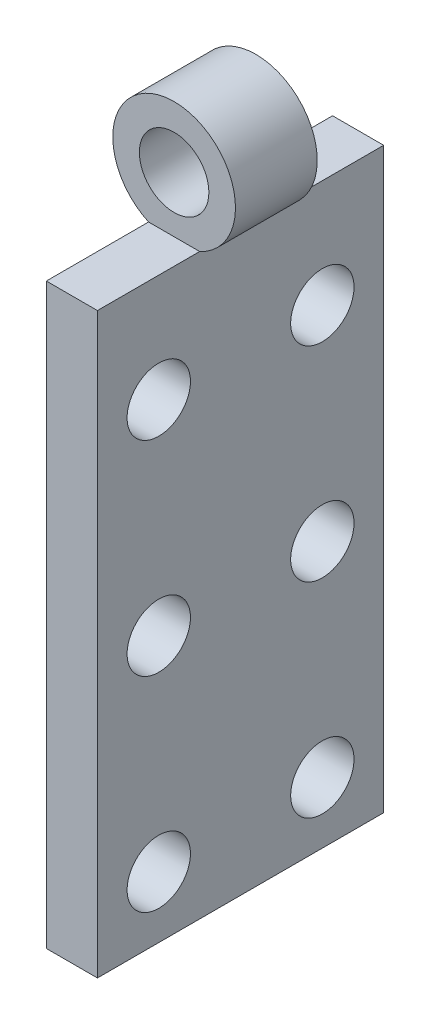
ISO-10303-21;
HEADER;
FILE_DESCRIPTION(('STEP AP214'),'2;1');
FILE_NAME('part.step','',(''),(''),'','','');
FILE_SCHEMA(('AUTOMOTIVE_DESIGN { 1 0 10303 214 1 1 1 1 }'));
ENDSEC;
DATA;
#1=APPLICATION_CONTEXT('core data for automotive mechanical design processes');
#2=APPLICATION_PROTOCOL_DEFINITION('international standard','automotive_design',2000,#1);
#3=PRODUCT_CONTEXT('',#1,'mechanical');
#4=PRODUCT('Part','Part','',(#3));
#5=PRODUCT_RELATED_PRODUCT_CATEGORY('part','',(#4));
#6=PRODUCT_DEFINITION_FORMATION('','',#4);
#7=PRODUCT_DEFINITION_CONTEXT('part definition',#1,'design');
#8=PRODUCT_DEFINITION('design','',#6,#7);
#9=PRODUCT_DEFINITION_SHAPE('','',#8);
#10=(LENGTH_UNIT() NAMED_UNIT(*) SI_UNIT(.MILLI.,.METRE.));
#11=(NAMED_UNIT(*) PLANE_ANGLE_UNIT() SI_UNIT($,.RADIAN.));
#12=(NAMED_UNIT(*) SI_UNIT($,.STERADIAN.) SOLID_ANGLE_UNIT());
#13=UNCERTAINTY_MEASURE_WITH_UNIT(LENGTH_MEASURE(1.E-05),#10,'distance_accuracy_value','');
#14=(GEOMETRIC_REPRESENTATION_CONTEXT(3) GLOBAL_UNCERTAINTY_ASSIGNED_CONTEXT((#13)) GLOBAL_UNIT_ASSIGNED_CONTEXT((#10,
#11,#12)) REPRESENTATION_CONTEXT('',''));
#15=CARTESIAN_POINT('',(0.,0.,0.));
#16=DIRECTION('',(0.,0.,1.));
#17=DIRECTION('',(1.,0.,0.));
#18=AXIS2_PLACEMENT_3D('',#15,#16,#17);
#19=CARTESIAN_POINT('',(-1.25,15.2728219713411,7.));
#20=DIRECTION('',(0.,1.,0.));
#21=DIRECTION('',(0.,0.,1.));
#22=AXIS2_PLACEMENT_3D('',#19,#20,#21);
#23=PLANE('',#22);
#24=DIRECTION('',(0.,0.,-1.));
#25=VECTOR('',#24,1.);
#26=CARTESIAN_POINT('',(-1.25,15.2728219713411,7.));
#27=LINE('',#26,#25);
#28=CARTESIAN_POINT('',(-1.25,15.2728219713411,-2.));
#29=VERTEX_POINT('',#28);
#30=CARTESIAN_POINT('',(-1.25,15.2728219713411,-7.));
#31=VERTEX_POINT('',#30);
#32=EDGE_CURVE('E117',#29,#31,#27,.T.);
#33=ORIENTED_EDGE('',*,*,#32,.F.);
#34=DIRECTION('',(1.,0.,0.));
#35=VECTOR('',#34,1.);
#36=CARTESIAN_POINT('',(-1.25,15.2728219713411,-2.));
#37=LINE('',#36,#35);
#38=CARTESIAN_POINT('',(1.25,15.2728219713411,-2.));
#39=VERTEX_POINT('',#38);
#40=EDGE_CURVE('E109',#29,#39,#37,.T.);
#41=ORIENTED_EDGE('',*,*,#40,.T.);
#42=DIRECTION('',(0.,0.,-1.));
#43=VECTOR('',#42,1.);
#44=CARTESIAN_POINT('',(1.25,15.2728219713411,7.));
#45=LINE('',#44,#43);
#46=CARTESIAN_POINT('',(1.25,15.2728219713411,-7.));
#47=VERTEX_POINT('',#46);
#48=EDGE_CURVE('E115',#39,#47,#45,.T.);
#49=ORIENTED_EDGE('',*,*,#48,.T.);
#50=DIRECTION('',(1.,0.,0.));
#51=VECTOR('',#50,1.);
#52=CARTESIAN_POINT('',(-1.25,15.2728219713411,-7.));
#53=LINE('',#52,#51);
#54=EDGE_CURVE('E172',#31,#47,#53,.T.);
#55=ORIENTED_EDGE('',*,*,#54,.F.);
#56=EDGE_LOOP('',(#33,#41,#49,#55));
#57=FACE_BOUND('',#56,.T.);
#58=ADVANCED_FACE('F35',(#57),#23,.T.);
#59=CARTESIAN_POINT('',(-1.25,-13.,7.));
#60=DIRECTION('',(0.,1.,0.));
#61=DIRECTION('',(0.,0.,1.));
#62=AXIS2_PLACEMENT_3D('',#59,#60,#61);
#63=PLANE('',#62);
#64=DIRECTION('',(1.,0.,0.));
#65=VECTOR('',#64,1.);
#66=CARTESIAN_POINT('',(-1.25,-13.,-7.));
#67=LINE('',#66,#65);
#68=CARTESIAN_POINT('',(-1.25,-13.,-7.));
#69=VERTEX_POINT('',#68);
#70=CARTESIAN_POINT('',(1.25,-13.,-7.));
#71=VERTEX_POINT('',#70);
#72=EDGE_CURVE('E103',#69,#71,#67,.T.);
#73=ORIENTED_EDGE('',*,*,#72,.T.);
#74=DIRECTION('',(0.,0.,-1.));
#75=VECTOR('',#74,1.);
#76=CARTESIAN_POINT('',(1.25,-13.,7.));
#77=LINE('',#76,#75);
#78=CARTESIAN_POINT('',(1.25,-13.,7.));
#79=VERTEX_POINT('',#78);
#80=EDGE_CURVE('E11',#79,#71,#77,.T.);
#81=ORIENTED_EDGE('',*,*,#80,.F.);
#82=DIRECTION('',(1.,0.,0.));
#83=VECTOR('',#82,1.);
#84=CARTESIAN_POINT('',(-1.25,-13.,7.));
#85=LINE('',#84,#83);
#86=CARTESIAN_POINT('',(-1.25,-13.,7.));
#87=VERTEX_POINT('',#86);
#88=EDGE_CURVE('E161',#87,#79,#85,.T.);
#89=ORIENTED_EDGE('',*,*,#88,.F.);
#90=DIRECTION('',(0.,0.,-1.));
#91=VECTOR('',#90,1.);
#92=CARTESIAN_POINT('',(-1.25,-13.,7.));
#93=LINE('',#92,#91);
#94=EDGE_CURVE('E61',#87,#69,#93,.T.);
#95=ORIENTED_EDGE('',*,*,#94,.T.);
#96=EDGE_LOOP('',(#73,#81,#89,#95));
#97=FACE_BOUND('',#96,.T.);
#98=ADVANCED_FACE('F37',(#97),#63,.F.);
#99=CARTESIAN_POINT('',(1.25,-13.,7.));
#100=DIRECTION('',(-1.,0.,0.));
#101=DIRECTION('',(0.,0.,1.));
#102=AXIS2_PLACEMENT_3D('',#99,#100,#101);
#103=PLANE('',#102);
#104=CARTESIAN_POINT('',(1.25,0.,4.));
#105=DIRECTION('',(1.,0.,0.));
#106=DIRECTION('',(0.,0.,-1.));
#107=AXIS2_PLACEMENT_3D('',#104,#105,#106);
#108=CIRCLE('',#107,1.55);
#109=CARTESIAN_POINT('',(1.25,0.,2.45));
#110=VERTEX_POINT('',#109);
#111=EDGE_CURVE('E214',#110,#110,#108,.T.);
#112=ORIENTED_EDGE('',*,*,#111,.F.);
#113=EDGE_LOOP('',(#112));
#114=FACE_BOUND('',#113,.T.);
#115=CARTESIAN_POINT('',(1.25,10.,4.));
#116=DIRECTION('',(1.,0.,0.));
#117=DIRECTION('',(0.,0.,-1.));
#118=AXIS2_PLACEMENT_3D('',#115,#116,#117);
#119=CIRCLE('',#118,1.55);
#120=CARTESIAN_POINT('',(1.25,10.,2.45));
#121=VERTEX_POINT('',#120);
#122=EDGE_CURVE('E218',#121,#121,#119,.T.);
#123=ORIENTED_EDGE('',*,*,#122,.F.);
#124=EDGE_LOOP('',(#123));
#125=FACE_BOUND('',#124,.T.);
#126=CARTESIAN_POINT('',(1.25,10.,-4.));
#127=DIRECTION('',(1.,0.,0.));
#128=DIRECTION('',(0.,0.,-1.));
#129=AXIS2_PLACEMENT_3D('',#126,#127,#128);
#130=CIRCLE('',#129,1.55);
#131=CARTESIAN_POINT('',(1.25,10.,-5.55));
#132=VERTEX_POINT('',#131);
#133=EDGE_CURVE('E222',#132,#132,#130,.T.);
#134=ORIENTED_EDGE('',*,*,#133,.F.);
#135=EDGE_LOOP('',(#134));
#136=FACE_BOUND('',#135,.T.);
#137=CARTESIAN_POINT('',(1.25,-10.,-4.));
#138=DIRECTION('',(1.,0.,0.));
#139=DIRECTION('',(0.,0.,1.));
#140=AXIS2_PLACEMENT_3D('',#137,#138,#139);
#141=CIRCLE('',#140,1.55);
#142=CARTESIAN_POINT('',(1.25,-10.,-2.45));
#143=VERTEX_POINT('',#142);
#144=EDGE_CURVE('E226',#143,#143,#141,.T.);
#145=ORIENTED_EDGE('',*,*,#144,.F.);
#146=EDGE_LOOP('',(#145));
#147=FACE_BOUND('',#146,.T.);
#148=CARTESIAN_POINT('',(1.25,-10.,4.));
#149=DIRECTION('',(1.,0.,0.));
#150=DIRECTION('',(0.,0.,1.));
#151=AXIS2_PLACEMENT_3D('',#148,#149,#150);
#152=CIRCLE('',#151,1.55);
#153=CARTESIAN_POINT('',(1.25,-10.,5.55));
#154=VERTEX_POINT('',#153);
#155=EDGE_CURVE('E230',#154,#154,#152,.T.);
#156=ORIENTED_EDGE('',*,*,#155,.F.);
#157=EDGE_LOOP('',(#156));
#158=FACE_BOUND('',#157,.T.);
#159=CARTESIAN_POINT('',(1.25,0.,-4.));
#160=DIRECTION('',(1.,0.,0.));
#161=DIRECTION('',(0.,0.,-1.));
#162=AXIS2_PLACEMENT_3D('',#159,#160,#161);
#163=CIRCLE('',#162,1.55);
#164=CARTESIAN_POINT('',(1.25,0.,-5.55));
#165=VERTEX_POINT('',#164);
#166=EDGE_CURVE('E137',#165,#165,#163,.T.);
#167=ORIENTED_EDGE('',*,*,#166,.F.);
#168=EDGE_LOOP('',(#167));
#169=FACE_BOUND('',#168,.T.);
#170=DIRECTION('',(0.,1.,0.));
#171=VECTOR('',#170,1.);
#172=CARTESIAN_POINT('',(1.25,-13.,-7.));
#173=LINE('',#172,#171);
#174=EDGE_CURVE('E121',#71,#47,#173,.T.);
#175=ORIENTED_EDGE('',*,*,#174,.T.);
#176=ORIENTED_EDGE('',*,*,#48,.F.);
#177=DIRECTION('',(0.,0.,-1.));
#178=VECTOR('',#177,1.);
#179=CARTESIAN_POINT('',(1.25,15.2728219713411,2.));
#180=LINE('',#179,#178);
#181=CARTESIAN_POINT('',(1.25,15.2728219713411,2.));
#182=VERTEX_POINT('',#181);
#183=EDGE_CURVE('E97',#39,#182,#180,.F.);
#184=ORIENTED_EDGE('',*,*,#183,.T.);
#185=CARTESIAN_POINT('',(1.25,15.2728219713411,7.));
#186=VERTEX_POINT('',#185);
#187=EDGE_CURVE('E44',#186,#182,#45,.T.);
#188=ORIENTED_EDGE('',*,*,#187,.F.);
#189=DIRECTION('',(0.,1.,0.));
#190=VECTOR('',#189,1.);
#191=CARTESIAN_POINT('',(1.25,-13.,7.));
#192=LINE('',#191,#190);
#193=EDGE_CURVE('E87',#79,#186,#192,.T.);
#194=ORIENTED_EDGE('',*,*,#193,.F.);
#195=ORIENTED_EDGE('',*,*,#80,.T.);
#196=EDGE_LOOP('',(#175,#176,#184,#188,#194,#195));
#197=FACE_BOUND('',#196,.T.);
#198=ADVANCED_FACE('F120',(#114,#125,#136,#147,#158,#169,#197),#103,.F.);
#199=DIRECTION('',(1.,0.,0.));
#200=VECTOR('',#199,1.);
#201=CARTESIAN_POINT('',(-1.25,15.2728219713411,2.));
#202=LINE('',#201,#200);
#203=CARTESIAN_POINT('',(-1.25,15.2728219713411,2.));
#204=VERTEX_POINT('',#203);
#205=EDGE_CURVE('E104',#204,#182,#202,.T.);
#206=ORIENTED_EDGE('',*,*,#205,.F.);
#207=CARTESIAN_POINT('',(-1.25,15.2728219713411,7.));
#208=VERTEX_POINT('',#207);
#209=EDGE_CURVE('E123',#208,#204,#27,.T.);
#210=ORIENTED_EDGE('',*,*,#209,.F.);
#211=DIRECTION('',(1.,0.,0.));
#212=VECTOR('',#211,1.);
#213=CARTESIAN_POINT('',(-1.25,15.2728219713411,7.));
#214=LINE('',#213,#212);
#215=EDGE_CURVE('E165',#208,#186,#214,.T.);
#216=ORIENTED_EDGE('',*,*,#215,.T.);
#217=ORIENTED_EDGE('',*,*,#187,.T.);
#218=EDGE_LOOP('',(#206,#210,#216,#217));
#219=FACE_BOUND('',#218,.T.);
#220=ADVANCED_FACE('F180',(#219),#23,.T.);
#221=CARTESIAN_POINT('',(-1.25,-13.,7.));
#222=DIRECTION('',(-1.,0.,0.));
#223=DIRECTION('',(0.,0.,1.));
#224=AXIS2_PLACEMENT_3D('',#221,#222,#223);
#225=PLANE('',#224);
#226=CARTESIAN_POINT('',(-1.25,0.,4.));
#227=DIRECTION('',(-1.,0.,0.));
#228=DIRECTION('',(0.,0.,1.));
#229=AXIS2_PLACEMENT_3D('',#226,#227,#228);
#230=CIRCLE('',#229,1.55);
#231=CARTESIAN_POINT('',(-1.25,0.,5.55));
#232=VERTEX_POINT('',#231);
#233=EDGE_CURVE('E39',#232,#232,#230,.T.);
#234=ORIENTED_EDGE('',*,*,#233,.F.);
#235=EDGE_LOOP('',(#234));
#236=FACE_BOUND('',#235,.T.);
#237=CARTESIAN_POINT('',(-1.25,10.,4.));
#238=DIRECTION('',(-1.,0.,0.));
#239=DIRECTION('',(0.,0.,1.));
#240=AXIS2_PLACEMENT_3D('',#237,#238,#239);
#241=CIRCLE('',#240,1.55);
#242=CARTESIAN_POINT('',(-1.25,10.,5.55));
#243=VERTEX_POINT('',#242);
#244=EDGE_CURVE('E145',#243,#243,#241,.T.);
#245=ORIENTED_EDGE('',*,*,#244,.F.);
#246=EDGE_LOOP('',(#245));
#247=FACE_BOUND('',#246,.T.);
#248=CARTESIAN_POINT('',(-1.25,10.,-4.));
#249=DIRECTION('',(-1.,0.,0.));
#250=DIRECTION('',(0.,0.,1.));
#251=AXIS2_PLACEMENT_3D('',#248,#249,#250);
#252=CIRCLE('',#251,1.55);
#253=CARTESIAN_POINT('',(-1.25,10.,-2.45));
#254=VERTEX_POINT('',#253);
#255=EDGE_CURVE('E143',#254,#254,#252,.T.);
#256=ORIENTED_EDGE('',*,*,#255,.F.);
#257=EDGE_LOOP('',(#256));
#258=FACE_BOUND('',#257,.T.);
#259=CARTESIAN_POINT('',(-1.25,-10.,-4.));
#260=DIRECTION('',(-1.,0.,0.));
#261=DIRECTION('',(0.,0.,1.));
#262=AXIS2_PLACEMENT_3D('',#259,#260,#261);
#263=CIRCLE('',#262,1.55);
#264=CARTESIAN_POINT('',(-1.25,-10.,-2.45));
#265=VERTEX_POINT('',#264);
#266=EDGE_CURVE('E140',#265,#265,#263,.T.);
#267=ORIENTED_EDGE('',*,*,#266,.F.);
#268=EDGE_LOOP('',(#267));
#269=FACE_BOUND('',#268,.T.);
#270=CARTESIAN_POINT('',(-1.25,-10.,4.));
#271=DIRECTION('',(-1.,0.,0.));
#272=DIRECTION('',(0.,0.,1.));
#273=AXIS2_PLACEMENT_3D('',#270,#271,#272);
#274=CIRCLE('',#273,1.55);
#275=CARTESIAN_POINT('',(-1.25,-10.,5.55));
#276=VERTEX_POINT('',#275);
#277=EDGE_CURVE('E136',#276,#276,#274,.T.);
#278=ORIENTED_EDGE('',*,*,#277,.F.);
#279=EDGE_LOOP('',(#278));
#280=FACE_BOUND('',#279,.T.);
#281=CARTESIAN_POINT('',(-1.25,0.,-4.));
#282=DIRECTION('',(-1.,0.,0.));
#283=DIRECTION('',(0.,0.,1.));
#284=AXIS2_PLACEMENT_3D('',#281,#282,#283);
#285=CIRCLE('',#284,1.55);
#286=CARTESIAN_POINT('',(-1.25,0.,-2.45));
#287=VERTEX_POINT('',#286);
#288=EDGE_CURVE('E133',#287,#287,#285,.T.);
#289=ORIENTED_EDGE('',*,*,#288,.F.);
#290=EDGE_LOOP('',(#289));
#291=FACE_BOUND('',#290,.T.);
#292=DIRECTION('',(0.,1.,0.));
#293=VECTOR('',#292,1.);
#294=CARTESIAN_POINT('',(-1.25,-13.,-7.));
#295=LINE('',#294,#293);
#296=EDGE_CURVE('E163',#69,#31,#295,.T.);
#297=ORIENTED_EDGE('',*,*,#296,.F.);
#298=ORIENTED_EDGE('',*,*,#94,.F.);
#299=DIRECTION('',(0.,1.,0.));
#300=VECTOR('',#299,1.);
#301=CARTESIAN_POINT('',(-1.25,-13.,7.));
#302=LINE('',#301,#300);
#303=EDGE_CURVE('E168',#87,#208,#302,.T.);
#304=ORIENTED_EDGE('',*,*,#303,.T.);
#305=ORIENTED_EDGE('',*,*,#209,.T.);
#306=EDGE_CURVE('E126',#204,#29,#27,.T.);
#307=ORIENTED_EDGE('',*,*,#306,.T.);
#308=ORIENTED_EDGE('',*,*,#32,.T.);
#309=EDGE_LOOP('',(#297,#298,#304,#305,#307,#308));
#310=FACE_BOUND('',#309,.T.);
#311=ADVANCED_FACE('F175',(#236,#247,#258,#269,#280,#291,#310),#225,.T.);
#312=CARTESIAN_POINT('',(0.,0.,7.));
#313=DIRECTION('',(0.,0.,1.));
#314=DIRECTION('',(1.,0.,0.));
#315=AXIS2_PLACEMENT_3D('',#312,#313,#314);
#316=PLANE('',#315);
#317=ORIENTED_EDGE('',*,*,#88,.T.);
#318=ORIENTED_EDGE('',*,*,#193,.T.);
#319=ORIENTED_EDGE('',*,*,#215,.F.);
#320=ORIENTED_EDGE('',*,*,#303,.F.);
#321=EDGE_LOOP('',(#317,#318,#319,#320));
#322=FACE_BOUND('',#321,.T.);
#323=ADVANCED_FACE('F184',(#322),#316,.T.);
#324=CARTESIAN_POINT('',(0.,0.,-7.));
#325=DIRECTION('',(0.,0.,1.));
#326=DIRECTION('',(1.,0.,0.));
#327=AXIS2_PLACEMENT_3D('',#324,#325,#326);
#328=PLANE('',#327);
#329=ORIENTED_EDGE('',*,*,#72,.F.);
#330=ORIENTED_EDGE('',*,*,#296,.T.);
#331=ORIENTED_EDGE('',*,*,#54,.T.);
#332=ORIENTED_EDGE('',*,*,#174,.F.);
#333=EDGE_LOOP('',(#329,#330,#331,#332));
#334=FACE_BOUND('',#333,.T.);
#335=ADVANCED_FACE('F187',(#334),#328,.F.);
#336=CARTESIAN_POINT('',(0.,18.,2.));
#337=DIRECTION('',(0.,0.,-1.));
#338=DIRECTION('',(-1.,0.,0.));
#339=AXIS2_PLACEMENT_3D('',#336,#337,#338);
#340=CYLINDRICAL_SURFACE('',#339,3.);
#341=ORIENTED_EDGE('',*,*,#183,.F.);
#342=CARTESIAN_POINT('',(0.,18.,-2.));
#343=DIRECTION('',(0.,0.,1.));
#344=DIRECTION('',(1.,0.,0.));
#345=AXIS2_PLACEMENT_3D('',#342,#343,#344);
#346=CIRCLE('',#345,3.);
#347=EDGE_CURVE('E52',#39,#29,#346,.T.);
#348=ORIENTED_EDGE('',*,*,#347,.T.);
#349=ORIENTED_EDGE('',*,*,#306,.F.);
#350=CARTESIAN_POINT('',(0.,18.,2.));
#351=DIRECTION('',(0.,0.,1.));
#352=DIRECTION('',(1.,0.,0.));
#353=AXIS2_PLACEMENT_3D('',#350,#351,#352);
#354=CIRCLE('',#353,3.);
#355=EDGE_CURVE('E100',#182,#204,#354,.T.);
#356=ORIENTED_EDGE('',*,*,#355,.F.);
#357=EDGE_LOOP('',(#341,#348,#349,#356));
#358=FACE_BOUND('',#357,.T.);
#359=ADVANCED_FACE('F98',(#358),#340,.T.);
#360=CARTESIAN_POINT('',(0.,18.,2.));
#361=DIRECTION('',(0.,0.,1.));
#362=DIRECTION('',(1.,0.,0.));
#363=AXIS2_PLACEMENT_3D('',#360,#361,#362);
#364=PLANE('',#363);
#365=CARTESIAN_POINT('',(0.,18.,2.));
#366=DIRECTION('',(0.,0.,1.));
#367=DIRECTION('',(1.,0.,0.));
#368=AXIS2_PLACEMENT_3D('',#365,#366,#367);
#369=CIRCLE('',#368,1.7);
#370=CARTESIAN_POINT('',(1.7,18.,2.));
#371=VERTEX_POINT('',#370);
#372=EDGE_CURVE('E132',#371,#371,#369,.T.);
#373=ORIENTED_EDGE('',*,*,#372,.F.);
#374=EDGE_LOOP('',(#373));
#375=FACE_BOUND('',#374,.T.);
#376=ORIENTED_EDGE('',*,*,#355,.T.);
#377=ORIENTED_EDGE('',*,*,#205,.T.);
#378=EDGE_LOOP('',(#376,#377));
#379=FACE_BOUND('',#378,.T.);
#380=ADVANCED_FACE('F178',(#375,#379),#364,.T.);
#381=CARTESIAN_POINT('',(0.,18.,-2.));
#382=DIRECTION('',(0.,0.,1.));
#383=DIRECTION('',(1.,0.,0.));
#384=AXIS2_PLACEMENT_3D('',#381,#382,#383);
#385=PLANE('',#384);
#386=CARTESIAN_POINT('',(0.,18.,-2.));
#387=DIRECTION('',(0.,0.,1.));
#388=DIRECTION('',(1.,0.,0.));
#389=AXIS2_PLACEMENT_3D('',#386,#387,#388);
#390=CIRCLE('',#389,1.7);
#391=CARTESIAN_POINT('',(1.7,18.,-2.));
#392=VERTEX_POINT('',#391);
#393=EDGE_CURVE('E111',#392,#392,#390,.T.);
#394=ORIENTED_EDGE('',*,*,#393,.T.);
#395=EDGE_LOOP('',(#394));
#396=FACE_BOUND('',#395,.T.);
#397=ORIENTED_EDGE('',*,*,#40,.F.);
#398=ORIENTED_EDGE('',*,*,#347,.F.);
#399=EDGE_LOOP('',(#397,#398));
#400=FACE_BOUND('',#399,.T.);
#401=ADVANCED_FACE('F108',(#396,#400),#385,.F.);
#402=CARTESIAN_POINT('',(0.,18.,-7.));
#403=DIRECTION('',(0.,0.,1.));
#404=DIRECTION('',(1.,0.,0.));
#405=AXIS2_PLACEMENT_3D('',#402,#403,#404);
#406=CYLINDRICAL_SURFACE('',#405,1.7);
#407=ORIENTED_EDGE('',*,*,#372,.T.);
#408=EDGE_LOOP('',(#407));
#409=FACE_BOUND('',#408,.T.);
#410=ORIENTED_EDGE('',*,*,#393,.F.);
#411=EDGE_LOOP('',(#410));
#412=FACE_BOUND('',#411,.T.);
#413=ADVANCED_FACE('F254',(#409,#412),#406,.F.);
#414=CARTESIAN_POINT('',(-3.,0.,-4.));
#415=DIRECTION('',(1.,0.,0.));
#416=DIRECTION('',(0.,0.,-1.));
#417=AXIS2_PLACEMENT_3D('',#414,#415,#416);
#418=CYLINDRICAL_SURFACE('',#417,1.55);
#419=ORIENTED_EDGE('',*,*,#288,.T.);
#420=EDGE_LOOP('',(#419));
#421=FACE_BOUND('',#420,.T.);
#422=ORIENTED_EDGE('',*,*,#166,.T.);
#423=EDGE_LOOP('',(#422));
#424=FACE_BOUND('',#423,.T.);
#425=ADVANCED_FACE('F244',(#421,#424),#418,.F.);
#426=CARTESIAN_POINT('',(-3.,-10.,4.));
#427=DIRECTION('',(1.,0.,0.));
#428=DIRECTION('',(0.,0.,-1.));
#429=AXIS2_PLACEMENT_3D('',#426,#427,#428);
#430=CYLINDRICAL_SURFACE('',#429,1.55);
#431=ORIENTED_EDGE('',*,*,#277,.T.);
#432=EDGE_LOOP('',(#431));
#433=FACE_BOUND('',#432,.T.);
#434=ORIENTED_EDGE('',*,*,#155,.T.);
#435=EDGE_LOOP('',(#434));
#436=FACE_BOUND('',#435,.T.);
#437=ADVANCED_FACE('F241',(#433,#436),#430,.F.);
#438=CARTESIAN_POINT('',(-3.,-10.,-4.));
#439=DIRECTION('',(1.,0.,0.));
#440=DIRECTION('',(0.,0.,-1.));
#441=AXIS2_PLACEMENT_3D('',#438,#439,#440);
#442=CYLINDRICAL_SURFACE('',#441,1.55);
#443=ORIENTED_EDGE('',*,*,#266,.T.);
#444=EDGE_LOOP('',(#443));
#445=FACE_BOUND('',#444,.T.);
#446=ORIENTED_EDGE('',*,*,#144,.T.);
#447=EDGE_LOOP('',(#446));
#448=FACE_BOUND('',#447,.T.);
#449=ADVANCED_FACE('F243',(#445,#448),#442,.F.);
#450=CARTESIAN_POINT('',(-3.,10.,-4.));
#451=DIRECTION('',(1.,0.,0.));
#452=DIRECTION('',(0.,0.,-1.));
#453=AXIS2_PLACEMENT_3D('',#450,#451,#452);
#454=CYLINDRICAL_SURFACE('',#453,1.55);
#455=ORIENTED_EDGE('',*,*,#255,.T.);
#456=EDGE_LOOP('',(#455));
#457=FACE_BOUND('',#456,.T.);
#458=ORIENTED_EDGE('',*,*,#133,.T.);
#459=EDGE_LOOP('',(#458));
#460=FACE_BOUND('',#459,.T.);
#461=ADVANCED_FACE('F251',(#457,#460),#454,.F.);
#462=CARTESIAN_POINT('',(-3.,10.,4.));
#463=DIRECTION('',(1.,0.,0.));
#464=DIRECTION('',(0.,0.,-1.));
#465=AXIS2_PLACEMENT_3D('',#462,#463,#464);
#466=CYLINDRICAL_SURFACE('',#465,1.55);
#467=ORIENTED_EDGE('',*,*,#244,.T.);
#468=EDGE_LOOP('',(#467));
#469=FACE_BOUND('',#468,.T.);
#470=ORIENTED_EDGE('',*,*,#122,.T.);
#471=EDGE_LOOP('',(#470));
#472=FACE_BOUND('',#471,.T.);
#473=ADVANCED_FACE('F261',(#469,#472),#466,.F.);
#474=CARTESIAN_POINT('',(-3.,0.,4.));
#475=DIRECTION('',(1.,0.,0.));
#476=DIRECTION('',(0.,0.,-1.));
#477=AXIS2_PLACEMENT_3D('',#474,#475,#476);
#478=CYLINDRICAL_SURFACE('',#477,1.55);
#479=ORIENTED_EDGE('',*,*,#233,.T.);
#480=EDGE_LOOP('',(#479));
#481=FACE_BOUND('',#480,.T.);
#482=ORIENTED_EDGE('',*,*,#111,.T.);
#483=EDGE_LOOP('',(#482));
#484=FACE_BOUND('',#483,.T.);
#485=ADVANCED_FACE('F258',(#481,#484),#478,.F.);
#486=CLOSED_SHELL('',(#58,#98,#198,#220,#311,#323,#335,#359,#380,#401,#413,#425,#437,#449,#461,
#473,#485));
#487=MANIFOLD_SOLID_BREP('B2',#486);
#488=ADVANCED_BREP_SHAPE_REPRESENTATION('',(#18,#487),#14);
#489=SHAPE_DEFINITION_REPRESENTATION(#9,#488);
ENDSEC;
END-ISO-10303-21;
